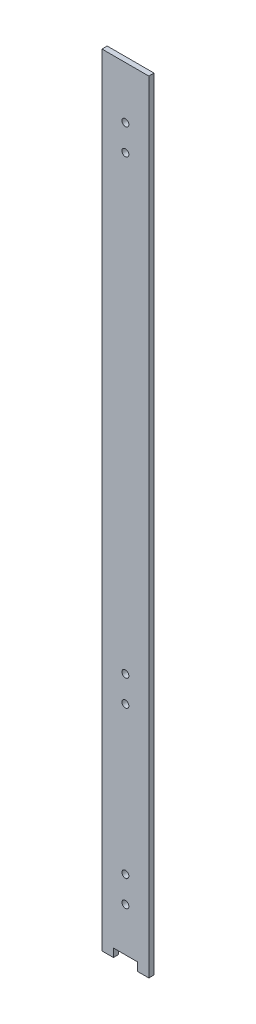
ISO-10303-21;
HEADER;
FILE_DESCRIPTION(('STEP AP214'),'2;1');
FILE_NAME('part.step','',(''),(''),'','','');
FILE_SCHEMA(('AUTOMOTIVE_DESIGN { 1 0 10303 214 1 1 1 1 }'));
ENDSEC;
DATA;
#1=APPLICATION_CONTEXT('core data for automotive mechanical design processes');
#2=APPLICATION_PROTOCOL_DEFINITION('international standard','automotive_design',2000,#1);
#3=PRODUCT_CONTEXT('',#1,'mechanical');
#4=PRODUCT('Part','Part','',(#3));
#5=PRODUCT_RELATED_PRODUCT_CATEGORY('part','',(#4));
#6=PRODUCT_DEFINITION_FORMATION('','',#4);
#7=PRODUCT_DEFINITION_CONTEXT('part definition',#1,'design');
#8=PRODUCT_DEFINITION('design','',#6,#7);
#9=PRODUCT_DEFINITION_SHAPE('','',#8);
#10=(LENGTH_UNIT() NAMED_UNIT(*) SI_UNIT(.MILLI.,.METRE.));
#11=(NAMED_UNIT(*) PLANE_ANGLE_UNIT() SI_UNIT($,.RADIAN.));
#12=(NAMED_UNIT(*) SI_UNIT($,.STERADIAN.) SOLID_ANGLE_UNIT());
#13=UNCERTAINTY_MEASURE_WITH_UNIT(LENGTH_MEASURE(1.E-05),#10,'distance_accuracy_value','');
#14=(GEOMETRIC_REPRESENTATION_CONTEXT(3) GLOBAL_UNCERTAINTY_ASSIGNED_CONTEXT((#13)) GLOBAL_UNIT_ASSIGNED_CONTEXT((#10,
#11,#12)) REPRESENTATION_CONTEXT('',''));
#15=CARTESIAN_POINT('',(0.,0.,0.));
#16=DIRECTION('',(0.,0.,1.));
#17=DIRECTION('',(1.,0.,0.));
#18=AXIS2_PLACEMENT_3D('',#15,#16,#17);
#19=CARTESIAN_POINT('',(0.,0.,0.));
#20=DIRECTION('',(0.,1.,0.));
#21=DIRECTION('',(0.,0.,1.));
#22=AXIS2_PLACEMENT_3D('',#19,#20,#21);
#23=PLANE('',#22);
#24=DIRECTION('',(1.,0.,0.));
#25=VECTOR('',#24,1.);
#26=CARTESIAN_POINT('',(13.5,0.,1.5));
#27=LINE('',#26,#25);
#28=CARTESIAN_POINT('',(6.91531792152884,0.,1.5));
#29=VERTEX_POINT('',#28);
#30=CARTESIAN_POINT('',(13.5,0.,1.5));
#31=VERTEX_POINT('',#30);
#32=EDGE_CURVE('E147',#29,#31,#27,.T.);
#33=ORIENTED_EDGE('',*,*,#32,.F.);
#34=DIRECTION('',(0.,0.,-1.));
#35=VECTOR('',#34,1.);
#36=CARTESIAN_POINT('',(6.91531792152884,0.,0.));
#37=LINE('',#36,#35);
#38=CARTESIAN_POINT('',(6.91531792152884,0.,-1.5));
#39=VERTEX_POINT('',#38);
#40=EDGE_CURVE('E11',#29,#39,#37,.T.);
#41=ORIENTED_EDGE('',*,*,#40,.T.);
#42=DIRECTION('',(-1.,0.,0.));
#43=VECTOR('',#42,1.);
#44=CARTESIAN_POINT('',(13.5,0.,-1.5));
#45=LINE('',#44,#43);
#46=CARTESIAN_POINT('',(13.5,0.,-1.5));
#47=VERTEX_POINT('',#46);
#48=EDGE_CURVE('E139',#47,#39,#45,.T.);
#49=ORIENTED_EDGE('',*,*,#48,.F.);
#50=DIRECTION('',(0.,0.,-1.));
#51=VECTOR('',#50,1.);
#52=CARTESIAN_POINT('',(13.5,0.,1.5));
#53=LINE('',#52,#51);
#54=EDGE_CURVE('E149',#31,#47,#53,.T.);
#55=ORIENTED_EDGE('',*,*,#54,.F.);
#56=EDGE_LOOP('',(#33,#41,#49,#55));
#57=FACE_BOUND('',#56,.T.);
#58=ADVANCED_FACE('F33',(#57),#23,.F.);
#59=CARTESIAN_POINT('',(-13.5,450.,1.5));
#60=DIRECTION('',(1.,0.,0.));
#61=DIRECTION('',(0.,0.,-1.));
#62=AXIS2_PLACEMENT_3D('',#59,#60,#61);
#63=PLANE('',#62);
#64=DIRECTION('',(0.,0.,1.));
#65=VECTOR('',#64,1.);
#66=CARTESIAN_POINT('',(-13.5,0.,1.5));
#67=LINE('',#66,#65);
#68=CARTESIAN_POINT('',(-13.5,0.,-1.5));
#69=VERTEX_POINT('',#68);
#70=CARTESIAN_POINT('',(-13.5,0.,1.5));
#71=VERTEX_POINT('',#70);
#72=EDGE_CURVE('E135',#69,#71,#67,.T.);
#73=ORIENTED_EDGE('',*,*,#72,.T.);
#74=DIRECTION('',(0.,-1.,0.));
#75=VECTOR('',#74,1.);
#76=CARTESIAN_POINT('',(-13.5,450.,1.5));
#77=LINE('',#76,#75);
#78=CARTESIAN_POINT('',(-13.5,450.,1.5));
#79=VERTEX_POINT('',#78);
#80=EDGE_CURVE('E160',#79,#71,#77,.T.);
#81=ORIENTED_EDGE('',*,*,#80,.F.);
#82=DIRECTION('',(0.,0.,1.));
#83=VECTOR('',#82,1.);
#84=CARTESIAN_POINT('',(-13.5,450.,1.5));
#85=LINE('',#84,#83);
#86=CARTESIAN_POINT('',(-13.5,450.,-1.5));
#87=VERTEX_POINT('',#86);
#88=EDGE_CURVE('E137',#87,#79,#85,.T.);
#89=ORIENTED_EDGE('',*,*,#88,.F.);
#90=DIRECTION('',(0.,-1.,0.));
#91=VECTOR('',#90,1.);
#92=CARTESIAN_POINT('',(-13.5,450.,-1.5));
#93=LINE('',#92,#91);
#94=EDGE_CURVE('E144',#87,#69,#93,.T.);
#95=ORIENTED_EDGE('',*,*,#94,.T.);
#96=EDGE_LOOP('',(#73,#81,#89,#95));
#97=FACE_BOUND('',#96,.T.);
#98=ADVANCED_FACE('F35',(#97),#63,.F.);
#99=CARTESIAN_POINT('',(13.5,450.,1.5));
#100=DIRECTION('',(0.,0.,-1.));
#101=DIRECTION('',(-1.,0.,0.));
#102=AXIS2_PLACEMENT_3D('',#99,#100,#101);
#103=PLANE('',#102);
#104=CARTESIAN_POINT('',(0.,145.,1.50000000000001));
#105=DIRECTION('',(0.,0.,-1.));
#106=DIRECTION('',(-1.,0.,0.));
#107=AXIS2_PLACEMENT_3D('',#104,#105,#106);
#108=CIRCLE('',#107,2.);
#109=CARTESIAN_POINT('',(-2.,145.,1.50000000000001));
#110=VERTEX_POINT('',#109);
#111=EDGE_CURVE('E249',#110,#110,#108,.T.);
#112=ORIENTED_EDGE('',*,*,#111,.T.);
#113=EDGE_LOOP('',(#112));
#114=FACE_BOUND('',#113,.T.);
#115=CARTESIAN_POINT('',(0.,130.,1.50000000000001));
#116=DIRECTION('',(0.,0.,-1.));
#117=DIRECTION('',(-1.,0.,0.));
#118=AXIS2_PLACEMENT_3D('',#115,#116,#117);
#119=CIRCLE('',#118,2.);
#120=CARTESIAN_POINT('',(-2.,130.,1.50000000000001));
#121=VERTEX_POINT('',#120);
#122=EDGE_CURVE('E239',#121,#121,#119,.T.);
#123=ORIENTED_EDGE('',*,*,#122,.T.);
#124=EDGE_LOOP('',(#123));
#125=FACE_BOUND('',#124,.T.);
#126=CARTESIAN_POINT('',(0.,45.,1.50000000000001));
#127=DIRECTION('',(0.,0.,-1.));
#128=DIRECTION('',(-1.,0.,0.));
#129=AXIS2_PLACEMENT_3D('',#126,#127,#128);
#130=CIRCLE('',#129,2.);
#131=CARTESIAN_POINT('',(-2.,45.,1.50000000000001));
#132=VERTEX_POINT('',#131);
#133=EDGE_CURVE('E234',#132,#132,#130,.T.);
#134=ORIENTED_EDGE('',*,*,#133,.T.);
#135=EDGE_LOOP('',(#134));
#136=FACE_BOUND('',#135,.T.);
#137=CARTESIAN_POINT('',(0.,30.,1.50000000000001));
#138=DIRECTION('',(0.,0.,-1.));
#139=DIRECTION('',(-1.,0.,0.));
#140=AXIS2_PLACEMENT_3D('',#137,#138,#139);
#141=CIRCLE('',#140,2.);
#142=CARTESIAN_POINT('',(-2.,30.,1.50000000000001));
#143=VERTEX_POINT('',#142);
#144=EDGE_CURVE('E262',#143,#143,#141,.T.);
#145=ORIENTED_EDGE('',*,*,#144,.T.);
#146=EDGE_LOOP('',(#145));
#147=FACE_BOUND('',#146,.T.);
#148=CARTESIAN_POINT('',(0.,405.,1.50000000000001));
#149=DIRECTION('',(0.,0.,-1.));
#150=DIRECTION('',(-1.,0.,0.));
#151=AXIS2_PLACEMENT_3D('',#148,#149,#150);
#152=CIRCLE('',#151,2.00000000000002);
#153=CARTESIAN_POINT('',(-2.00000000000002,405.,1.50000000000001));
#154=VERTEX_POINT('',#153);
#155=EDGE_CURVE('E255',#154,#154,#152,.T.);
#156=ORIENTED_EDGE('',*,*,#155,.T.);
#157=EDGE_LOOP('',(#156));
#158=FACE_BOUND('',#157,.T.);
#159=CARTESIAN_POINT('',(0.,420.,1.50000000000001));
#160=DIRECTION('',(0.,0.,-1.));
#161=DIRECTION('',(-1.,0.,0.));
#162=AXIS2_PLACEMENT_3D('',#159,#160,#161);
#163=CIRCLE('',#162,1.99999999999999);
#164=CARTESIAN_POINT('',(-1.99999999999999,420.,1.50000000000001));
#165=VERTEX_POINT('',#164);
#166=EDGE_CURVE('E132',#165,#165,#163,.T.);
#167=ORIENTED_EDGE('',*,*,#166,.T.);
#168=EDGE_LOOP('',(#167));
#169=FACE_BOUND('',#168,.T.);
#170=DIRECTION('',(1.,0.,0.));
#171=VECTOR('',#170,1.);
#172=CARTESIAN_POINT('',(-6.91531792152884,4.77912167963543,1.5));
#173=LINE('',#172,#171);
#174=CARTESIAN_POINT('',(-6.91531792152884,4.77912167963543,1.5));
#175=VERTEX_POINT('',#174);
#176=CARTESIAN_POINT('',(6.91531792152884,4.77912167963543,1.5));
#177=VERTEX_POINT('',#176);
#178=EDGE_CURVE('E114',#175,#177,#173,.T.);
#179=ORIENTED_EDGE('',*,*,#178,.T.);
#180=DIRECTION('',(0.,-1.,0.));
#181=VECTOR('',#180,1.);
#182=CARTESIAN_POINT('',(6.91531792152884,-4.77912167963543,1.5));
#183=LINE('',#182,#181);
#184=EDGE_CURVE('E124',#177,#29,#183,.T.);
#185=ORIENTED_EDGE('',*,*,#184,.T.);
#186=ORIENTED_EDGE('',*,*,#32,.T.);
#187=DIRECTION('',(0.,-1.,0.));
#188=VECTOR('',#187,1.);
#189=CARTESIAN_POINT('',(13.5,450.,1.5));
#190=LINE('',#189,#188);
#191=CARTESIAN_POINT('',(13.5,450.,1.5));
#192=VERTEX_POINT('',#191);
#193=EDGE_CURVE('E157',#192,#31,#190,.T.);
#194=ORIENTED_EDGE('',*,*,#193,.F.);
#195=DIRECTION('',(1.,0.,0.));
#196=VECTOR('',#195,1.);
#197=CARTESIAN_POINT('',(13.5,450.,1.5));
#198=LINE('',#197,#196);
#199=EDGE_CURVE('E86',#79,#192,#198,.T.);
#200=ORIENTED_EDGE('',*,*,#199,.F.);
#201=ORIENTED_EDGE('',*,*,#80,.T.);
#202=CARTESIAN_POINT('',(-6.91531792152884,0.,1.5));
#203=VERTEX_POINT('',#202);
#204=EDGE_CURVE('E123',#71,#203,#27,.T.);
#205=ORIENTED_EDGE('',*,*,#204,.T.);
#206=DIRECTION('',(0.,1.,0.));
#207=VECTOR('',#206,1.);
#208=CARTESIAN_POINT('',(-6.91531792152884,-4.77912167963543,1.5));
#209=LINE('',#208,#207);
#210=EDGE_CURVE('E48',#203,#175,#209,.T.);
#211=ORIENTED_EDGE('',*,*,#210,.T.);
#212=EDGE_LOOP('',(#179,#185,#186,#194,#200,#201,#205,#211));
#213=FACE_BOUND('',#212,.T.);
#214=ADVANCED_FACE('F122',(#114,#125,#136,#147,#158,#169,#213),#103,.F.);
#215=CARTESIAN_POINT('',(13.5,450.,1.5));
#216=DIRECTION('',(-1.,0.,0.));
#217=DIRECTION('',(0.,0.,1.));
#218=AXIS2_PLACEMENT_3D('',#215,#216,#217);
#219=PLANE('',#218);
#220=ORIENTED_EDGE('',*,*,#54,.T.);
#221=DIRECTION('',(0.,-1.,0.));
#222=VECTOR('',#221,1.);
#223=CARTESIAN_POINT('',(13.5,450.,-1.5));
#224=LINE('',#223,#222);
#225=CARTESIAN_POINT('',(13.5,450.,-1.5));
#226=VERTEX_POINT('',#225);
#227=EDGE_CURVE('E154',#226,#47,#224,.T.);
#228=ORIENTED_EDGE('',*,*,#227,.F.);
#229=DIRECTION('',(0.,0.,-1.));
#230=VECTOR('',#229,1.);
#231=CARTESIAN_POINT('',(13.5,450.,1.5));
#232=LINE('',#231,#230);
#233=EDGE_CURVE('E141',#192,#226,#232,.T.);
#234=ORIENTED_EDGE('',*,*,#233,.F.);
#235=ORIENTED_EDGE('',*,*,#193,.T.);
#236=EDGE_LOOP('',(#220,#228,#234,#235));
#237=FACE_BOUND('',#236,.T.);
#238=ADVANCED_FACE('F174',(#237),#219,.F.);
#239=CARTESIAN_POINT('',(13.5,450.,-1.5));
#240=DIRECTION('',(0.,0.,1.));
#241=DIRECTION('',(1.,0.,0.));
#242=AXIS2_PLACEMENT_3D('',#239,#240,#241);
#243=PLANE('',#242);
#244=CARTESIAN_POINT('',(0.,145.,-1.5));
#245=DIRECTION('',(0.,0.,-1.));
#246=DIRECTION('',(-1.,0.,0.));
#247=AXIS2_PLACEMENT_3D('',#244,#245,#246);
#248=CIRCLE('',#247,2.);
#249=CARTESIAN_POINT('',(-2.,145.,-1.5));
#250=VERTEX_POINT('',#249);
#251=EDGE_CURVE('E252',#250,#250,#248,.T.);
#252=ORIENTED_EDGE('',*,*,#251,.F.);
#253=EDGE_LOOP('',(#252));
#254=FACE_BOUND('',#253,.T.);
#255=CARTESIAN_POINT('',(0.,130.,-1.5));
#256=DIRECTION('',(0.,0.,-1.));
#257=DIRECTION('',(-1.,0.,0.));
#258=AXIS2_PLACEMENT_3D('',#255,#256,#257);
#259=CIRCLE('',#258,2.);
#260=CARTESIAN_POINT('',(-2.,130.,-1.5));
#261=VERTEX_POINT('',#260);
#262=EDGE_CURVE('E244',#261,#261,#259,.T.);
#263=ORIENTED_EDGE('',*,*,#262,.F.);
#264=EDGE_LOOP('',(#263));
#265=FACE_BOUND('',#264,.T.);
#266=CARTESIAN_POINT('',(0.,45.,-1.5));
#267=DIRECTION('',(0.,0.,-1.));
#268=DIRECTION('',(-1.,0.,0.));
#269=AXIS2_PLACEMENT_3D('',#266,#267,#268);
#270=CIRCLE('',#269,2.);
#271=CARTESIAN_POINT('',(-2.,45.,-1.5));
#272=VERTEX_POINT('',#271);
#273=EDGE_CURVE('E237',#272,#272,#270,.T.);
#274=ORIENTED_EDGE('',*,*,#273,.F.);
#275=EDGE_LOOP('',(#274));
#276=FACE_BOUND('',#275,.T.);
#277=CARTESIAN_POINT('',(0.,30.,-1.5));
#278=DIRECTION('',(0.,0.,-1.));
#279=DIRECTION('',(-1.,0.,0.));
#280=AXIS2_PLACEMENT_3D('',#277,#278,#279);
#281=CIRCLE('',#280,2.);
#282=CARTESIAN_POINT('',(-2.,30.,-1.5));
#283=VERTEX_POINT('',#282);
#284=EDGE_CURVE('E241',#283,#283,#281,.T.);
#285=ORIENTED_EDGE('',*,*,#284,.F.);
#286=EDGE_LOOP('',(#285));
#287=FACE_BOUND('',#286,.T.);
#288=CARTESIAN_POINT('',(0.,405.,-1.5));
#289=DIRECTION('',(0.,0.,-1.));
#290=DIRECTION('',(-1.,0.,0.));
#291=AXIS2_PLACEMENT_3D('',#288,#289,#290);
#292=CIRCLE('',#291,2.00000000000002);
#293=CARTESIAN_POINT('',(-2.00000000000002,405.,-1.5));
#294=VERTEX_POINT('',#293);
#295=EDGE_CURVE('E259',#294,#294,#292,.T.);
#296=ORIENTED_EDGE('',*,*,#295,.F.);
#297=EDGE_LOOP('',(#296));
#298=FACE_BOUND('',#297,.T.);
#299=CARTESIAN_POINT('',(0.,420.,-1.5));
#300=DIRECTION('',(0.,0.,-1.));
#301=DIRECTION('',(-1.,0.,0.));
#302=AXIS2_PLACEMENT_3D('',#299,#300,#301);
#303=CIRCLE('',#302,1.99999999999999);
#304=CARTESIAN_POINT('',(-1.99999999999999,420.,-1.5));
#305=VERTEX_POINT('',#304);
#306=EDGE_CURVE('E258',#305,#305,#303,.T.);
#307=ORIENTED_EDGE('',*,*,#306,.F.);
#308=EDGE_LOOP('',(#307));
#309=FACE_BOUND('',#308,.T.);
#310=ORIENTED_EDGE('',*,*,#48,.T.);
#311=DIRECTION('',(0.,-1.,0.));
#312=VECTOR('',#311,1.);
#313=CARTESIAN_POINT('',(6.91531792152884,-4.77912167963543,-1.5));
#314=LINE('',#313,#312);
#315=CARTESIAN_POINT('',(6.91531792152884,4.77912167963543,-1.5));
#316=VERTEX_POINT('',#315);
#317=EDGE_CURVE('E130',#316,#39,#314,.T.);
#318=ORIENTED_EDGE('',*,*,#317,.F.);
#319=DIRECTION('',(1.,0.,0.));
#320=VECTOR('',#319,1.);
#321=CARTESIAN_POINT('',(-6.91531792152884,4.77912167963543,-1.5));
#322=LINE('',#321,#320);
#323=CARTESIAN_POINT('',(-6.91531792152884,4.77912167963543,-1.5));
#324=VERTEX_POINT('',#323);
#325=EDGE_CURVE('E126',#324,#316,#322,.T.);
#326=ORIENTED_EDGE('',*,*,#325,.F.);
#327=DIRECTION('',(0.,1.,0.));
#328=VECTOR('',#327,1.);
#329=CARTESIAN_POINT('',(-6.91531792152884,-4.77912167963543,-1.5));
#330=LINE('',#329,#328);
#331=CARTESIAN_POINT('',(-6.91531792152884,0.,-1.5));
#332=VERTEX_POINT('',#331);
#333=EDGE_CURVE('E109',#332,#324,#330,.T.);
#334=ORIENTED_EDGE('',*,*,#333,.F.);
#335=EDGE_CURVE('E78',#332,#69,#45,.T.);
#336=ORIENTED_EDGE('',*,*,#335,.T.);
#337=ORIENTED_EDGE('',*,*,#94,.F.);
#338=DIRECTION('',(-1.,0.,0.));
#339=VECTOR('',#338,1.);
#340=CARTESIAN_POINT('',(13.5,450.,-1.5));
#341=LINE('',#340,#339);
#342=EDGE_CURVE('E57',#226,#87,#341,.T.);
#343=ORIENTED_EDGE('',*,*,#342,.F.);
#344=ORIENTED_EDGE('',*,*,#227,.T.);
#345=EDGE_LOOP('',(#310,#318,#326,#334,#336,#337,#343,#344));
#346=FACE_BOUND('',#345,.T.);
#347=ADVANCED_FACE('F164',(#254,#265,#276,#287,#298,#309,#346),#243,.F.);
#348=CARTESIAN_POINT('',(0.,450.,0.));
#349=DIRECTION('',(0.,1.,0.));
#350=DIRECTION('',(0.,0.,1.));
#351=AXIS2_PLACEMENT_3D('',#348,#349,#350);
#352=PLANE('',#351);
#353=ORIENTED_EDGE('',*,*,#88,.T.);
#354=ORIENTED_EDGE('',*,*,#199,.T.);
#355=ORIENTED_EDGE('',*,*,#233,.T.);
#356=ORIENTED_EDGE('',*,*,#342,.T.);
#357=EDGE_LOOP('',(#353,#354,#355,#356));
#358=FACE_BOUND('',#357,.T.);
#359=ADVANCED_FACE('F176',(#358),#352,.T.);
#360=ORIENTED_EDGE('',*,*,#335,.F.);
#361=DIRECTION('',(0.,0.,1.));
#362=VECTOR('',#361,1.);
#363=CARTESIAN_POINT('',(-6.91531792152884,0.,0.));
#364=LINE('',#363,#362);
#365=EDGE_CURVE('E41',#332,#203,#364,.T.);
#366=ORIENTED_EDGE('',*,*,#365,.T.);
#367=ORIENTED_EDGE('',*,*,#204,.F.);
#368=ORIENTED_EDGE('',*,*,#72,.F.);
#369=EDGE_LOOP('',(#360,#366,#367,#368));
#370=FACE_BOUND('',#369,.T.);
#371=ADVANCED_FACE('F162',(#370),#23,.F.);
#372=CARTESIAN_POINT('',(6.91531792152884,-4.77912167963543,1.5));
#373=DIRECTION('',(1.,0.,0.));
#374=DIRECTION('',(0.,0.,-1.));
#375=AXIS2_PLACEMENT_3D('',#372,#373,#374);
#376=PLANE('',#375);
#377=ORIENTED_EDGE('',*,*,#184,.F.);
#378=DIRECTION('',(0.,0.,-1.));
#379=VECTOR('',#378,1.);
#380=CARTESIAN_POINT('',(6.91531792152884,4.77912167963543,1.5));
#381=LINE('',#380,#379);
#382=EDGE_CURVE('E113',#177,#316,#381,.T.);
#383=ORIENTED_EDGE('',*,*,#382,.T.);
#384=ORIENTED_EDGE('',*,*,#317,.T.);
#385=ORIENTED_EDGE('',*,*,#40,.F.);
#386=EDGE_LOOP('',(#377,#383,#384,#385));
#387=FACE_BOUND('',#386,.T.);
#388=ADVANCED_FACE('F168',(#387),#376,.F.);
#389=CARTESIAN_POINT('',(-6.91531792152884,-4.77912167963543,1.5));
#390=DIRECTION('',(-1.,0.,0.));
#391=DIRECTION('',(0.,0.,1.));
#392=AXIS2_PLACEMENT_3D('',#389,#390,#391);
#393=PLANE('',#392);
#394=ORIENTED_EDGE('',*,*,#333,.T.);
#395=DIRECTION('',(0.,0.,-1.));
#396=VECTOR('',#395,1.);
#397=CARTESIAN_POINT('',(-6.91531792152884,4.77912167963543,1.5));
#398=LINE('',#397,#396);
#399=EDGE_CURVE('E106',#175,#324,#398,.T.);
#400=ORIENTED_EDGE('',*,*,#399,.F.);
#401=ORIENTED_EDGE('',*,*,#210,.F.);
#402=ORIENTED_EDGE('',*,*,#365,.F.);
#403=EDGE_LOOP('',(#394,#400,#401,#402));
#404=FACE_BOUND('',#403,.T.);
#405=ADVANCED_FACE('F108',(#404),#393,.F.);
#406=CARTESIAN_POINT('',(-6.91531792152884,4.77912167963543,1.5));
#407=DIRECTION('',(0.,1.,0.));
#408=DIRECTION('',(0.,0.,1.));
#409=AXIS2_PLACEMENT_3D('',#406,#407,#408);
#410=PLANE('',#409);
#411=ORIENTED_EDGE('',*,*,#325,.T.);
#412=ORIENTED_EDGE('',*,*,#382,.F.);
#413=ORIENTED_EDGE('',*,*,#178,.F.);
#414=ORIENTED_EDGE('',*,*,#399,.T.);
#415=EDGE_LOOP('',(#411,#412,#413,#414));
#416=FACE_BOUND('',#415,.T.);
#417=ADVANCED_FACE('F117',(#416),#410,.F.);
#418=CARTESIAN_POINT('',(0.,420.,1.50000000000001));
#419=DIRECTION('',(0.,0.,-1.));
#420=DIRECTION('',(-1.,0.,0.));
#421=AXIS2_PLACEMENT_3D('',#418,#419,#420);
#422=CYLINDRICAL_SURFACE('',#421,1.99999999999999);
#423=ORIENTED_EDGE('',*,*,#166,.F.);
#424=EDGE_LOOP('',(#423));
#425=FACE_BOUND('',#424,.T.);
#426=ORIENTED_EDGE('',*,*,#306,.T.);
#427=EDGE_LOOP('',(#426));
#428=FACE_BOUND('',#427,.T.);
#429=ADVANCED_FACE('F206',(#425,#428),#422,.F.);
#430=CARTESIAN_POINT('',(0.,405.,1.50000000000001));
#431=DIRECTION('',(0.,0.,-1.));
#432=DIRECTION('',(-1.,0.,0.));
#433=AXIS2_PLACEMENT_3D('',#430,#431,#432);
#434=CYLINDRICAL_SURFACE('',#433,2.00000000000002);
#435=ORIENTED_EDGE('',*,*,#155,.F.);
#436=EDGE_LOOP('',(#435));
#437=FACE_BOUND('',#436,.T.);
#438=ORIENTED_EDGE('',*,*,#295,.T.);
#439=EDGE_LOOP('',(#438));
#440=FACE_BOUND('',#439,.T.);
#441=ADVANCED_FACE('F209',(#437,#440),#434,.F.);
#442=CARTESIAN_POINT('',(0.,30.,1.50000000000001));
#443=DIRECTION('',(0.,0.,-1.));
#444=DIRECTION('',(-1.,0.,0.));
#445=AXIS2_PLACEMENT_3D('',#442,#443,#444);
#446=CYLINDRICAL_SURFACE('',#445,2.);
#447=ORIENTED_EDGE('',*,*,#144,.F.);
#448=EDGE_LOOP('',(#447));
#449=FACE_BOUND('',#448,.T.);
#450=ORIENTED_EDGE('',*,*,#284,.T.);
#451=EDGE_LOOP('',(#450));
#452=FACE_BOUND('',#451,.T.);
#453=ADVANCED_FACE('F211',(#449,#452),#446,.F.);
#454=CARTESIAN_POINT('',(0.,45.,1.50000000000001));
#455=DIRECTION('',(0.,0.,-1.));
#456=DIRECTION('',(-1.,0.,0.));
#457=AXIS2_PLACEMENT_3D('',#454,#455,#456);
#458=CYLINDRICAL_SURFACE('',#457,2.);
#459=ORIENTED_EDGE('',*,*,#133,.F.);
#460=EDGE_LOOP('',(#459));
#461=FACE_BOUND('',#460,.T.);
#462=ORIENTED_EDGE('',*,*,#273,.T.);
#463=EDGE_LOOP('',(#462));
#464=FACE_BOUND('',#463,.T.);
#465=ADVANCED_FACE('F214',(#461,#464),#458,.F.);
#466=CARTESIAN_POINT('',(0.,130.,1.50000000000001));
#467=DIRECTION('',(0.,0.,-1.));
#468=DIRECTION('',(-1.,0.,0.));
#469=AXIS2_PLACEMENT_3D('',#466,#467,#468);
#470=CYLINDRICAL_SURFACE('',#469,2.);
#471=ORIENTED_EDGE('',*,*,#122,.F.);
#472=EDGE_LOOP('',(#471));
#473=FACE_BOUND('',#472,.T.);
#474=ORIENTED_EDGE('',*,*,#262,.T.);
#475=EDGE_LOOP('',(#474));
#476=FACE_BOUND('',#475,.T.);
#477=ADVANCED_FACE('F222',(#473,#476),#470,.F.);
#478=CARTESIAN_POINT('',(0.,145.,1.50000000000001));
#479=DIRECTION('',(0.,0.,-1.));
#480=DIRECTION('',(-1.,0.,0.));
#481=AXIS2_PLACEMENT_3D('',#478,#479,#480);
#482=CYLINDRICAL_SURFACE('',#481,2.);
#483=ORIENTED_EDGE('',*,*,#111,.F.);
#484=EDGE_LOOP('',(#483));
#485=FACE_BOUND('',#484,.T.);
#486=ORIENTED_EDGE('',*,*,#251,.T.);
#487=EDGE_LOOP('',(#486));
#488=FACE_BOUND('',#487,.T.);
#489=ADVANCED_FACE('F219',(#485,#488),#482,.F.);
#490=CLOSED_SHELL('',(#58,#98,#214,#238,#347,#359,#371,#388,#405,#417,#429,#441,#453,#465,#477,#489));
#491=MANIFOLD_SOLID_BREP('B2',#490);
#492=ADVANCED_BREP_SHAPE_REPRESENTATION('',(#18,#491),#14);
#493=SHAPE_DEFINITION_REPRESENTATION(#9,#492);
ENDSEC;
END-ISO-10303-21;
